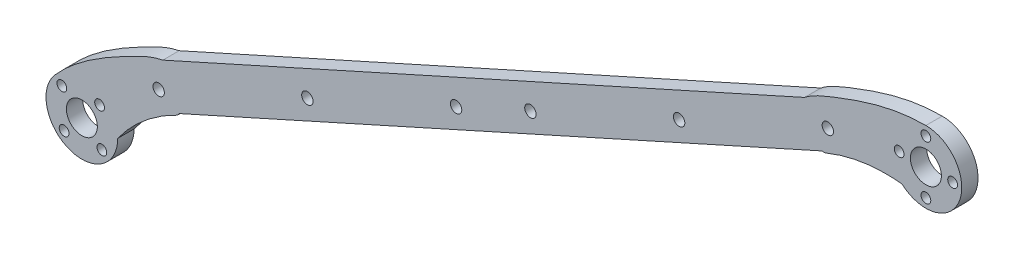
ISO-10303-21;
HEADER;
FILE_DESCRIPTION(('STEP AP214'),'2;1');
FILE_NAME('part.step','',(''),(''),'','','');
FILE_SCHEMA(('AUTOMOTIVE_DESIGN { 1 0 10303 214 1 1 1 1 }'));
ENDSEC;
DATA;
#1=APPLICATION_CONTEXT('core data for automotive mechanical design processes');
#2=APPLICATION_PROTOCOL_DEFINITION('international standard','automotive_design',2000,#1);
#3=PRODUCT_CONTEXT('',#1,'mechanical');
#4=PRODUCT('Part','Part','',(#3));
#5=PRODUCT_RELATED_PRODUCT_CATEGORY('part','',(#4));
#6=PRODUCT_DEFINITION_FORMATION('','',#4);
#7=PRODUCT_DEFINITION_CONTEXT('part definition',#1,'design');
#8=PRODUCT_DEFINITION('design','',#6,#7);
#9=PRODUCT_DEFINITION_SHAPE('','',#8);
#10=(LENGTH_UNIT() NAMED_UNIT(*) SI_UNIT(.MILLI.,.METRE.));
#11=(NAMED_UNIT(*) PLANE_ANGLE_UNIT() SI_UNIT($,.RADIAN.));
#12=(NAMED_UNIT(*) SI_UNIT($,.STERADIAN.) SOLID_ANGLE_UNIT());
#13=UNCERTAINTY_MEASURE_WITH_UNIT(LENGTH_MEASURE(1.E-05),#10,'distance_accuracy_value','');
#14=(GEOMETRIC_REPRESENTATION_CONTEXT(3) GLOBAL_UNCERTAINTY_ASSIGNED_CONTEXT((#13)) GLOBAL_UNIT_ASSIGNED_CONTEXT((#10,
#11,#12)) REPRESENTATION_CONTEXT('',''));
#15=CARTESIAN_POINT('',(0.,0.,0.));
#16=DIRECTION('',(0.,0.,1.));
#17=DIRECTION('',(1.,0.,0.));
#18=AXIS2_PLACEMENT_3D('',#15,#16,#17);
#19=CARTESIAN_POINT('',(-19.0941770977098,-8.43318287138601,5.));
#20=DIRECTION('',(0.,0.,-1.));
#21=DIRECTION('',(-1.,0.,0.));
#22=AXIS2_PLACEMENT_3D('',#19,#20,#21);
#23=PLANE('',#22);
#24=CARTESIAN_POINT('',(-30.5499471959969,-11.5955622866371,5.));
#25=CARTESIAN_POINT('',(-23.0287483220892,-8.51171838883883,5.));
#26=CARTESIAN_POINT('',(-15.2617011691616,-7.37824850597816,5.));
#27=CARTESIAN_POINT('',(-7.33212111192934,-8.2,5.));
#28=B_SPLINE_CURVE_WITH_KNOTS('',3,(#24,#25,#26,#27),.UNSPECIFIED.,.F.,.F.,(4,4),(0.,
0.928485629099403),.UNSPECIFIED.);
#29=CARTESIAN_POINT('',(-30.5499471959969,-11.595562286637,5.));
#30=VERTEX_POINT('',#29);
#31=CARTESIAN_POINT('',(-7.33212111192934,-8.2,5.));
#32=VERTEX_POINT('',#31);
#33=EDGE_CURVE('E186',#30,#32,#28,.T.);
#34=ORIENTED_EDGE('',*,*,#33,.T.);
#35=CARTESIAN_POINT('',(0.,0.,5.));
#36=DIRECTION('',(0.,0.,1.));
#37=DIRECTION('',(1.,0.,0.));
#38=AXIS2_PLACEMENT_3D('',#35,#36,#37);
#39=CIRCLE('',#38,11.);
#40=CARTESIAN_POINT('',(0.,11.,5.));
#41=VERTEX_POINT('',#40);
#42=EDGE_CURVE('E104',#32,#41,#39,.T.);
#43=ORIENTED_EDGE('',*,*,#42,.T.);
#44=CARTESIAN_POINT('',(0.,11.,5.));
#45=CARTESIAN_POINT('',(-10.1101240344233,10.9882488076497,5.));
#46=CARTESIAN_POINT('',(-22.331904830044,6.92754020950869,5.));
#47=CARTESIAN_POINT('',(-34.7332411971314,1.80300777675755,5.));
#48=CARTESIAN_POINT('',(-37.2233274582157,-0.160922186825868,5.));
#49=B_SPLINE_CURVE_WITH_KNOTS('',3,(#44,#45,#46,#47,#48),.UNSPECIFIED.,.F.,.F.,(4,1,4),
(0.0398764755532066,0.76340919900868,1.),.UNSPECIFIED.);
#50=CARTESIAN_POINT('',(-37.2233274582157,-0.160922186825868,5.));
#51=VERTEX_POINT('',#50);
#52=EDGE_CURVE('E207',#41,#51,#49,.T.);
#53=ORIENTED_EDGE('',*,*,#52,.T.);
#54=DIRECTION('',(-0.912045728476409,-0.410088513821023,0.));
#55=VECTOR('',#54,1.);
#56=CARTESIAN_POINT('',(-37.2233274582158,-0.160922186825877,5.));
#57=LINE('',#56,#55);
#58=CARTESIAN_POINT('',(-234.014760878466,-88.645418023272,5.));
#59=VERTEX_POINT('',#58);
#60=EDGE_CURVE('E226',#51,#59,#57,.T.);
#61=ORIENTED_EDGE('',*,*,#60,.T.);
#62=CARTESIAN_POINT('',(-234.014760878466,-88.645418023272,5.));
#63=CARTESIAN_POINT('',(-237.13641474897,-89.2047279572726,5.));
#64=CARTESIAN_POINT('',(-249.199971308159,-95.0804899918692,5.));
#65=CARTESIAN_POINT('',(-260.348583277408,-101.527949281724,5.));
#66=CARTESIAN_POINT('',(-267.067006190117,-109.082917160407,5.));
#67=B_SPLINE_CURVE_WITH_KNOTS('',3,(#62,#63,#64,#65,#66),.UNSPECIFIED.,.F.,.F.,(4,1,4),
(0.0398764755532066,0.276467276544526,1.),.UNSPECIFIED.);
#68=CARTESIAN_POINT('',(-267.067006190117,-109.082917160407,5.));
#69=VERTEX_POINT('',#68);
#70=EDGE_CURVE('E223',#59,#69,#67,.T.);
#71=ORIENTED_EDGE('',*,*,#70,.T.);
#72=CARTESIAN_POINT('',(-258.838577688908,-116.383120198712,5.));
#73=DIRECTION('',(0.,0.,1.));
#74=DIRECTION('',(-1.,0.,0.));
#75=AXIS2_PLACEMENT_3D('',#72,#73,#74);
#76=CIRCLE('',#75,11.);
#77=CARTESIAN_POINT('',(-247.838660731776,-116.340377524383,5.));
#78=VERTEX_POINT('',#77);
#79=EDGE_CURVE('E225',#69,#78,#76,.T.);
#80=ORIENTED_EDGE('',*,*,#79,.T.);
#81=CARTESIAN_POINT('',(-247.838660731776,-116.340377524383,5.));
#82=CARTESIAN_POINT('',(-243.190858821597,-109.863383406298,5.));
#83=CARTESIAN_POINT('',(-237.188340902156,-104.805562326234,5.));
#84=CARTESIAN_POINT('',(-229.890025639162,-101.226020454874,5.));
#85=B_SPLINE_CURVE_WITH_KNOTS('',3,(#81,#82,#83,#84),.UNSPECIFIED.,.F.,.F.,(4,4),(0.,
0.928485629099403),.UNSPECIFIED.);
#86=CARTESIAN_POINT('',(-229.890025639162,-101.226020454874,5.));
#87=VERTEX_POINT('',#86);
#88=EDGE_CURVE('E129',#78,#87,#85,.T.);
#89=ORIENTED_EDGE('',*,*,#88,.T.);
#90=CARTESIAN_POINT('',(-230.770724166718,-99.4303673415022,5.));
#91=DIRECTION('',(0.,0.,1.));
#92=DIRECTION('',(1.,0.,0.));
#93=AXIS2_PLACEMENT_3D('',#90,#91,#92);
#94=CIRCLE('',#93,1.99999999999988);
#95=CARTESIAN_POINT('',(-228.983312246708,-100.327673659437,5.));
#96=VERTEX_POINT('',#95);
#97=EDGE_CURVE('E123',#87,#96,#94,.T.);
#98=ORIENTED_EDGE('',*,*,#97,.T.);
#99=DIRECTION('',(0.91204572847641,0.410088513821023,0.));
#100=VECTOR('',#99,1.);
#101=CARTESIAN_POINT('',(-228.983312246708,-100.327673659437,5.));
#102=LINE('',#101,#100);
#103=CARTESIAN_POINT('',(-31.8236903085434,-11.6776270425826,5.));
#104=VERTEX_POINT('',#103);
#105=EDGE_CURVE('E127',#96,#104,#102,.T.);
#106=ORIENTED_EDGE('',*,*,#105,.T.);
#107=CARTESIAN_POINT('',(-31.3086858496027,-9.74507163399268,5.));
#108=DIRECTION('',(0.,0.,1.));
#109=DIRECTION('',(-1.,0.,0.));
#110=AXIS2_PLACEMENT_3D('',#107,#108,#109);
#111=CIRCLE('',#110,1.99999999999989);
#112=EDGE_CURVE('E55',#104,#30,#111,.T.);
#113=ORIENTED_EDGE('',*,*,#112,.T.);
#114=EDGE_LOOP('',(#34,#43,#53,#61,#71,#80,#89,#98,#106,#113));
#115=FACE_BOUND('',#114,.T.);
#116=CARTESIAN_POINT('',(-8.2,0.,5.));
#117=DIRECTION('',(0.,0.,1.));
#118=DIRECTION('',(1.,0.,0.));
#119=AXIS2_PLACEMENT_3D('',#116,#117,#118);
#120=CIRCLE('',#119,1.5);
#121=CARTESIAN_POINT('',(-6.7,0.,5.));
#122=VERTEX_POINT('',#121);
#123=EDGE_CURVE('E153',#122,#122,#120,.T.);
#124=ORIENTED_EDGE('',*,*,#123,.F.);
#125=EDGE_LOOP('',(#124));
#126=FACE_BOUND('',#125,.T.);
#127=CARTESIAN_POINT('',(0.,8.2,5.));
#128=DIRECTION('',(0.,0.,1.));
#129=DIRECTION('',(1.,0.,0.));
#130=AXIS2_PLACEMENT_3D('',#127,#128,#129);
#131=CIRCLE('',#130,1.5);
#132=CARTESIAN_POINT('',(1.5,8.2,5.));
#133=VERTEX_POINT('',#132);
#134=EDGE_CURVE('E264',#133,#133,#131,.T.);
#135=ORIENTED_EDGE('',*,*,#134,.F.);
#136=EDGE_LOOP('',(#135));
#137=FACE_BOUND('',#136,.T.);
#138=CARTESIAN_POINT('',(0.,-8.2,5.));
#139=DIRECTION('',(0.,0.,1.));
#140=DIRECTION('',(1.,0.,0.));
#141=AXIS2_PLACEMENT_3D('',#138,#139,#140);
#142=CIRCLE('',#141,1.5);
#143=CARTESIAN_POINT('',(1.5,-8.2,5.));
#144=VERTEX_POINT('',#143);
#145=EDGE_CURVE('E270',#144,#144,#142,.T.);
#146=ORIENTED_EDGE('',*,*,#145,.F.);
#147=EDGE_LOOP('',(#146));
#148=FACE_BOUND('',#147,.T.);
#149=CARTESIAN_POINT('',(8.2,0.,5.));
#150=DIRECTION('',(0.,0.,1.));
#151=DIRECTION('',(1.,0.,0.));
#152=AXIS2_PLACEMENT_3D('',#149,#150,#151);
#153=CIRCLE('',#152,1.5);
#154=CARTESIAN_POINT('',(9.7,0.,5.));
#155=VERTEX_POINT('',#154);
#156=EDGE_CURVE('E276',#155,#155,#153,.T.);
#157=ORIENTED_EDGE('',*,*,#156,.F.);
#158=EDGE_LOOP('',(#157));
#159=FACE_BOUND('',#158,.T.);
#160=CARTESIAN_POINT('',(0.,0.,5.));
#161=DIRECTION('',(0.,0.,1.));
#162=DIRECTION('',(1.,0.,0.));
#163=AXIS2_PLACEMENT_3D('',#160,#161,#162);
#164=CIRCLE('',#163,4.75);
#165=CARTESIAN_POINT('',(4.75,0.,5.));
#166=VERTEX_POINT('',#165);
#167=EDGE_CURVE('E282',#166,#166,#164,.T.);
#168=ORIENTED_EDGE('',*,*,#167,.F.);
#169=EDGE_LOOP('',(#168));
#170=FACE_BOUND('',#169,.T.);
#171=CARTESIAN_POINT('',(-30.0717688274586,-4.81157505708729,5.));
#172=DIRECTION('',(0.,0.,1.));
#173=DIRECTION('',(1.,0.,0.));
#174=AXIS2_PLACEMENT_3D('',#171,#172,#173);
#175=CIRCLE('',#174,1.75);
#176=CARTESIAN_POINT('',(-28.3217688274586,-4.81157505708729,5.));
#177=VERTEX_POINT('',#176);
#178=EDGE_CURVE('E288',#177,#177,#175,.T.);
#179=ORIENTED_EDGE('',*,*,#178,.F.);
#180=EDGE_LOOP('',(#179));
#181=FACE_BOUND('',#180,.T.);
#182=CARTESIAN_POINT('',(-75.674055251279,-25.3160007481384,5.));
#183=DIRECTION('',(0.,0.,1.));
#184=DIRECTION('',(1.,0.,0.));
#185=AXIS2_PLACEMENT_3D('',#182,#183,#184);
#186=CIRCLE('',#185,1.75);
#187=CARTESIAN_POINT('',(-73.924055251279,-25.3160007481384,5.));
#188=VERTEX_POINT('',#187);
#189=EDGE_CURVE('E294',#188,#188,#186,.T.);
#190=ORIENTED_EDGE('',*,*,#189,.F.);
#191=EDGE_LOOP('',(#190));
#192=FACE_BOUND('',#191,.T.);
#193=CARTESIAN_POINT('',(-121.276341675099,-45.8204264391896,5.));
#194=DIRECTION('',(0.,0.,1.));
#195=DIRECTION('',(1.,0.,0.));
#196=AXIS2_PLACEMENT_3D('',#193,#194,#195);
#197=CIRCLE('',#196,1.75);
#198=CARTESIAN_POINT('',(-119.526341675099,-45.8204264391896,5.));
#199=VERTEX_POINT('',#198);
#200=EDGE_CURVE('E300',#199,#199,#197,.T.);
#201=ORIENTED_EDGE('',*,*,#200,.F.);
#202=EDGE_LOOP('',(#201));
#203=FACE_BOUND('',#202,.T.);
#204=CARTESIAN_POINT('',(-235.282057734646,-97.0814906668156,5.));
#205=DIRECTION('',(0.,0.,1.));
#206=DIRECTION('',(-1.,0.,0.));
#207=AXIS2_PLACEMENT_3D('',#204,#205,#206);
#208=CIRCLE('',#207,1.75000000000002);
#209=CARTESIAN_POINT('',(-237.032057734646,-97.0814906668156,5.));
#210=VERTEX_POINT('',#209);
#211=EDGE_CURVE('E306',#210,#210,#208,.T.);
#212=ORIENTED_EDGE('',*,*,#211,.F.);
#213=EDGE_LOOP('',(#212));
#214=FACE_BOUND('',#213,.T.);
#215=CARTESIAN_POINT('',(-189.679771310826,-76.5770649757645,5.));
#216=DIRECTION('',(0.,0.,1.));
#217=DIRECTION('',(-1.,0.,0.));
#218=AXIS2_PLACEMENT_3D('',#215,#216,#217);
#219=CIRCLE('',#218,1.75000000000002);
#220=CARTESIAN_POINT('',(-191.429771310826,-76.5770649757645,5.));
#221=VERTEX_POINT('',#220);
#222=EDGE_CURVE('E312',#221,#221,#219,.T.);
#223=ORIENTED_EDGE('',*,*,#222,.F.);
#224=EDGE_LOOP('',(#223));
#225=FACE_BOUND('',#224,.T.);
#226=CARTESIAN_POINT('',(-258.838577688908,-116.383120198712,5.));
#227=DIRECTION('',(0.,0.,1.));
#228=DIRECTION('',(-1.,0.,0.));
#229=AXIS2_PLACEMENT_3D('',#226,#227,#228);
#230=CIRCLE('',#229,4.75);
#231=CARTESIAN_POINT('',(-263.588577688908,-116.383120198712,5.));
#232=VERTEX_POINT('',#231);
#233=EDGE_CURVE('E318',#232,#232,#230,.T.);
#234=ORIENTED_EDGE('',*,*,#233,.F.);
#235=EDGE_LOOP('',(#234));
#236=FACE_BOUND('',#235,.T.);
#237=CARTESIAN_POINT('',(-264.280547226554,-122.517039626886,5.));
#238=DIRECTION('',(0.,0.,1.));
#239=DIRECTION('',(-1.,0.,0.));
#240=AXIS2_PLACEMENT_3D('',#237,#238,#239);
#241=CIRCLE('',#240,1.49999999999994);
#242=CARTESIAN_POINT('',(-265.780547226554,-122.517039626886,5.));
#243=VERTEX_POINT('',#242);
#244=EDGE_CURVE('E324',#243,#243,#241,.T.);
#245=ORIENTED_EDGE('',*,*,#244,.F.);
#246=EDGE_LOOP('',(#245));
#247=FACE_BOUND('',#246,.T.);
#248=CARTESIAN_POINT('',(-252.704658260734,-121.825089736358,5.));
#249=DIRECTION('',(0.,0.,1.));
#250=DIRECTION('',(-1.,0.,0.));
#251=AXIS2_PLACEMENT_3D('',#248,#249,#250);
#252=CIRCLE('',#251,1.49999999999994);
#253=CARTESIAN_POINT('',(-254.204658260734,-121.825089736358,5.));
#254=VERTEX_POINT('',#253);
#255=EDGE_CURVE('E330',#254,#254,#252,.T.);
#256=ORIENTED_EDGE('',*,*,#255,.F.);
#257=EDGE_LOOP('',(#256));
#258=FACE_BOUND('',#257,.T.);
#259=CARTESIAN_POINT('',(-264.972497117082,-110.941150661066,5.));
#260=DIRECTION('',(0.,0.,1.));
#261=DIRECTION('',(-1.,0.,0.));
#262=AXIS2_PLACEMENT_3D('',#259,#260,#261);
#263=CIRCLE('',#262,1.49999999999998);
#264=CARTESIAN_POINT('',(-266.472497117082,-110.941150661066,5.));
#265=VERTEX_POINT('',#264);
#266=EDGE_CURVE('E336',#265,#265,#263,.T.);
#267=ORIENTED_EDGE('',*,*,#266,.F.);
#268=EDGE_LOOP('',(#267));
#269=FACE_BOUND('',#268,.T.);
#270=CARTESIAN_POINT('',(-144.077484887006,-56.0726392847133,5.));
#271=DIRECTION('',(0.,0.,1.));
#272=DIRECTION('',(-1.,0.,0.));
#273=AXIS2_PLACEMENT_3D('',#270,#271,#272);
#274=CIRCLE('',#273,1.74999999999999);
#275=CARTESIAN_POINT('',(-145.827484887006,-56.0726392847133,5.));
#276=VERTEX_POINT('',#275);
#277=EDGE_CURVE('E342',#276,#276,#274,.T.);
#278=ORIENTED_EDGE('',*,*,#277,.F.);
#279=EDGE_LOOP('',(#278));
#280=FACE_BOUND('',#279,.T.);
#281=CARTESIAN_POINT('',(-253.396608151262,-110.249200770538,5.));
#282=DIRECTION('',(0.,0.,1.));
#283=DIRECTION('',(-1.,0.,0.));
#284=AXIS2_PLACEMENT_3D('',#281,#282,#283);
#285=CIRCLE('',#284,1.50000000000004);
#286=CARTESIAN_POINT('',(-254.896608151262,-110.249200770538,5.));
#287=VERTEX_POINT('',#286);
#288=EDGE_CURVE('E348',#287,#287,#285,.T.);
#289=ORIENTED_EDGE('',*,*,#288,.F.);
#290=EDGE_LOOP('',(#289));
#291=FACE_BOUND('',#290,.T.);
#292=ADVANCED_FACE('F37',(#115,#126,#137,#148,#159,#170,#181,#192,#203,#214,#225,#236,#247,#258,
#269,#280,#291),#23,.F.);
#293=CARTESIAN_POINT('',(-19.0941770977098,-8.43318287138601,0.));
#294=DIRECTION('',(0.,0.,-1.));
#295=DIRECTION('',(-1.,0.,0.));
#296=AXIS2_PLACEMENT_3D('',#293,#294,#295);
#297=PLANE('',#296);
#298=CARTESIAN_POINT('',(-144.077484887006,-56.0726392847133,0.));
#299=DIRECTION('',(0.,0.,1.));
#300=DIRECTION('',(-1.,0.,0.));
#301=AXIS2_PLACEMENT_3D('',#298,#299,#300);
#302=CIRCLE('',#301,1.74999999999999);
#303=CARTESIAN_POINT('',(-145.827484887006,-56.0726392847133,0.));
#304=VERTEX_POINT('',#303);
#305=EDGE_CURVE('E345',#304,#304,#302,.T.);
#306=ORIENTED_EDGE('',*,*,#305,.T.);
#307=EDGE_LOOP('',(#306));
#308=FACE_BOUND('',#307,.T.);
#309=CARTESIAN_POINT('',(-252.704658260734,-121.825089736358,0.));
#310=DIRECTION('',(0.,0.,1.));
#311=DIRECTION('',(-1.,0.,0.));
#312=AXIS2_PLACEMENT_3D('',#309,#310,#311);
#313=CIRCLE('',#312,1.49999999999994);
#314=CARTESIAN_POINT('',(-254.204658260734,-121.825089736358,0.));
#315=VERTEX_POINT('',#314);
#316=EDGE_CURVE('E333',#315,#315,#313,.T.);
#317=ORIENTED_EDGE('',*,*,#316,.T.);
#318=EDGE_LOOP('',(#317));
#319=FACE_BOUND('',#318,.T.);
#320=CARTESIAN_POINT('',(-258.838577688908,-116.383120198712,0.));
#321=DIRECTION('',(0.,0.,1.));
#322=DIRECTION('',(-1.,0.,0.));
#323=AXIS2_PLACEMENT_3D('',#320,#321,#322);
#324=CIRCLE('',#323,4.75);
#325=CARTESIAN_POINT('',(-263.588577688908,-116.383120198712,0.));
#326=VERTEX_POINT('',#325);
#327=EDGE_CURVE('E321',#326,#326,#324,.T.);
#328=ORIENTED_EDGE('',*,*,#327,.T.);
#329=EDGE_LOOP('',(#328));
#330=FACE_BOUND('',#329,.T.);
#331=CARTESIAN_POINT('',(-235.282057734646,-97.0814906668156,0.));
#332=DIRECTION('',(0.,0.,1.));
#333=DIRECTION('',(-1.,0.,0.));
#334=AXIS2_PLACEMENT_3D('',#331,#332,#333);
#335=CIRCLE('',#334,1.75000000000002);
#336=CARTESIAN_POINT('',(-237.032057734646,-97.0814906668156,0.));
#337=VERTEX_POINT('',#336);
#338=EDGE_CURVE('E309',#337,#337,#335,.T.);
#339=ORIENTED_EDGE('',*,*,#338,.T.);
#340=EDGE_LOOP('',(#339));
#341=FACE_BOUND('',#340,.T.);
#342=CARTESIAN_POINT('',(-75.674055251279,-25.3160007481384,0.));
#343=DIRECTION('',(0.,0.,1.));
#344=DIRECTION('',(1.,0.,0.));
#345=AXIS2_PLACEMENT_3D('',#342,#343,#344);
#346=CIRCLE('',#345,1.75);
#347=CARTESIAN_POINT('',(-73.924055251279,-25.3160007481384,0.));
#348=VERTEX_POINT('',#347);
#349=EDGE_CURVE('E297',#348,#348,#346,.T.);
#350=ORIENTED_EDGE('',*,*,#349,.T.);
#351=EDGE_LOOP('',(#350));
#352=FACE_BOUND('',#351,.T.);
#353=CARTESIAN_POINT('',(0.,0.,0.));
#354=DIRECTION('',(0.,0.,1.));
#355=DIRECTION('',(1.,0.,0.));
#356=AXIS2_PLACEMENT_3D('',#353,#354,#355);
#357=CIRCLE('',#356,4.75);
#358=CARTESIAN_POINT('',(4.75,0.,0.));
#359=VERTEX_POINT('',#358);
#360=EDGE_CURVE('E285',#359,#359,#357,.T.);
#361=ORIENTED_EDGE('',*,*,#360,.T.);
#362=EDGE_LOOP('',(#361));
#363=FACE_BOUND('',#362,.T.);
#364=CARTESIAN_POINT('',(0.,-8.2,0.));
#365=DIRECTION('',(0.,0.,1.));
#366=DIRECTION('',(1.,0.,0.));
#367=AXIS2_PLACEMENT_3D('',#364,#365,#366);
#368=CIRCLE('',#367,1.5);
#369=CARTESIAN_POINT('',(1.5,-8.2,0.));
#370=VERTEX_POINT('',#369);
#371=EDGE_CURVE('E273',#370,#370,#368,.T.);
#372=ORIENTED_EDGE('',*,*,#371,.T.);
#373=EDGE_LOOP('',(#372));
#374=FACE_BOUND('',#373,.T.);
#375=CARTESIAN_POINT('',(-8.2,0.,0.));
#376=DIRECTION('',(0.,0.,1.));
#377=DIRECTION('',(1.,0.,0.));
#378=AXIS2_PLACEMENT_3D('',#375,#376,#377);
#379=CIRCLE('',#378,1.5);
#380=CARTESIAN_POINT('',(-6.7,0.,0.));
#381=VERTEX_POINT('',#380);
#382=EDGE_CURVE('E258',#381,#381,#379,.T.);
#383=ORIENTED_EDGE('',*,*,#382,.T.);
#384=EDGE_LOOP('',(#383));
#385=FACE_BOUND('',#384,.T.);
#386=CARTESIAN_POINT('',(-30.5499471959969,-11.5955622866371,0.));
#387=CARTESIAN_POINT('',(-23.0287483220892,-8.51171838883883,0.));
#388=CARTESIAN_POINT('',(-15.2617011691616,-7.37824850597816,0.));
#389=CARTESIAN_POINT('',(-7.33212111192934,-8.2,0.));
#390=B_SPLINE_CURVE_WITH_KNOTS('',3,(#386,#387,#388,#389),.UNSPECIFIED.,.F.,.F.,(4,4),(0.,
0.928485629099403),.UNSPECIFIED.);
#391=CARTESIAN_POINT('',(-30.5499471959969,-11.595562286637,0.));
#392=VERTEX_POINT('',#391);
#393=CARTESIAN_POINT('',(-7.33212111192934,-8.2,0.));
#394=VERTEX_POINT('',#393);
#395=EDGE_CURVE('E147',#392,#394,#390,.T.);
#396=ORIENTED_EDGE('',*,*,#395,.F.);
#397=CARTESIAN_POINT('',(-31.3086858496027,-9.74507163399268,0.));
#398=DIRECTION('',(0.,0.,1.));
#399=DIRECTION('',(-1.,0.,0.));
#400=AXIS2_PLACEMENT_3D('',#397,#398,#399);
#401=CIRCLE('',#400,1.99999999999989);
#402=CARTESIAN_POINT('',(-31.8236903085434,-11.6776270425826,0.));
#403=VERTEX_POINT('',#402);
#404=EDGE_CURVE('E96',#403,#392,#401,.T.);
#405=ORIENTED_EDGE('',*,*,#404,.F.);
#406=DIRECTION('',(0.91204572847641,0.410088513821023,0.));
#407=VECTOR('',#406,1.);
#408=CARTESIAN_POINT('',(-228.983312246708,-100.327673659437,0.));
#409=LINE('',#408,#407);
#410=CARTESIAN_POINT('',(-228.983312246708,-100.327673659437,0.));
#411=VERTEX_POINT('',#410);
#412=EDGE_CURVE('E90',#411,#403,#409,.T.);
#413=ORIENTED_EDGE('',*,*,#412,.F.);
#414=CARTESIAN_POINT('',(-230.770724166718,-99.4303673415022,0.));
#415=DIRECTION('',(0.,0.,1.));
#416=DIRECTION('',(1.,0.,0.));
#417=AXIS2_PLACEMENT_3D('',#414,#415,#416);
#418=CIRCLE('',#417,1.99999999999988);
#419=CARTESIAN_POINT('',(-229.890025639162,-101.226020454874,0.));
#420=VERTEX_POINT('',#419);
#421=EDGE_CURVE('E137',#420,#411,#418,.T.);
#422=ORIENTED_EDGE('',*,*,#421,.F.);
#423=CARTESIAN_POINT('',(-247.838660731776,-116.340377524383,0.));
#424=CARTESIAN_POINT('',(-243.190858821597,-109.863383406298,0.));
#425=CARTESIAN_POINT('',(-237.188340902156,-104.805562326234,0.));
#426=CARTESIAN_POINT('',(-229.890025639162,-101.226020454874,0.));
#427=B_SPLINE_CURVE_WITH_KNOTS('',3,(#423,#424,#425,#426),.UNSPECIFIED.,.F.,.F.,(4,4),(0.,
0.928485629099403),.UNSPECIFIED.);
#428=CARTESIAN_POINT('',(-247.838660731776,-116.340377524383,0.));
#429=VERTEX_POINT('',#428);
#430=EDGE_CURVE('E176',#429,#420,#427,.T.);
#431=ORIENTED_EDGE('',*,*,#430,.F.);
#432=CARTESIAN_POINT('',(-258.838577688908,-116.383120198712,0.));
#433=DIRECTION('',(0.,0.,1.));
#434=DIRECTION('',(-1.,0.,0.));
#435=AXIS2_PLACEMENT_3D('',#432,#433,#434);
#436=CIRCLE('',#435,11.);
#437=CARTESIAN_POINT('',(-267.067006190117,-109.082917160407,0.));
#438=VERTEX_POINT('',#437);
#439=EDGE_CURVE('E171',#438,#429,#436,.T.);
#440=ORIENTED_EDGE('',*,*,#439,.F.);
#441=CARTESIAN_POINT('',(-234.014760878466,-88.645418023272,0.));
#442=CARTESIAN_POINT('',(-237.13641474897,-89.2047279572726,0.));
#443=CARTESIAN_POINT('',(-249.199971308159,-95.0804899918692,0.));
#444=CARTESIAN_POINT('',(-260.348583277408,-101.527949281724,0.));
#445=CARTESIAN_POINT('',(-267.067006190117,-109.082917160407,0.));
#446=B_SPLINE_CURVE_WITH_KNOTS('',3,(#441,#442,#443,#444,#445),.UNSPECIFIED.,.F.,.F.,(4,1,4),
(0.0398764755532066,0.276467276544526,1.),.UNSPECIFIED.);
#447=CARTESIAN_POINT('',(-234.014760878466,-88.645418023272,0.));
#448=VERTEX_POINT('',#447);
#449=EDGE_CURVE('E167',#448,#438,#446,.T.);
#450=ORIENTED_EDGE('',*,*,#449,.F.);
#451=DIRECTION('',(-0.912045728476409,-0.410088513821023,0.));
#452=VECTOR('',#451,1.);
#453=CARTESIAN_POINT('',(-37.2233274582158,-0.160922186825877,0.));
#454=LINE('',#453,#452);
#455=CARTESIAN_POINT('',(-37.2233274582157,-0.160922186825868,0.));
#456=VERTEX_POINT('',#455);
#457=EDGE_CURVE('E162',#456,#448,#454,.T.);
#458=ORIENTED_EDGE('',*,*,#457,.F.);
#459=CARTESIAN_POINT('',(0.,11.,0.));
#460=CARTESIAN_POINT('',(-10.1101240344233,10.9882488076497,0.));
#461=CARTESIAN_POINT('',(-22.331904830044,6.92754020950869,0.));
#462=CARTESIAN_POINT('',(-34.7332411971314,1.80300777675755,0.));
#463=CARTESIAN_POINT('',(-37.2233274582157,-0.160922186825868,0.));
#464=B_SPLINE_CURVE_WITH_KNOTS('',3,(#459,#460,#461,#462,#463),.UNSPECIFIED.,.F.,.F.,(4,1,4),
(0.0398764755532066,0.76340919900868,1.),.UNSPECIFIED.);
#465=CARTESIAN_POINT('',(0.,11.,0.));
#466=VERTEX_POINT('',#465);
#467=EDGE_CURVE('E158',#466,#456,#464,.T.);
#468=ORIENTED_EDGE('',*,*,#467,.F.);
#469=CARTESIAN_POINT('',(0.,0.,0.));
#470=DIRECTION('',(0.,0.,1.));
#471=DIRECTION('',(1.,0.,0.));
#472=AXIS2_PLACEMENT_3D('',#469,#470,#471);
#473=CIRCLE('',#472,11.);
#474=EDGE_CURVE('E152',#394,#466,#473,.T.);
#475=ORIENTED_EDGE('',*,*,#474,.F.);
#476=EDGE_LOOP('',(#396,#405,#413,#422,#431,#440,#450,#458,#468,#475));
#477=FACE_BOUND('',#476,.T.);
#478=CARTESIAN_POINT('',(0.,8.2,0.));
#479=DIRECTION('',(0.,0.,1.));
#480=DIRECTION('',(1.,0.,0.));
#481=AXIS2_PLACEMENT_3D('',#478,#479,#480);
#482=CIRCLE('',#481,1.5);
#483=CARTESIAN_POINT('',(1.5,8.2,0.));
#484=VERTEX_POINT('',#483);
#485=EDGE_CURVE('E267',#484,#484,#482,.T.);
#486=ORIENTED_EDGE('',*,*,#485,.T.);
#487=EDGE_LOOP('',(#486));
#488=FACE_BOUND('',#487,.T.);
#489=CARTESIAN_POINT('',(8.2,0.,0.));
#490=DIRECTION('',(0.,0.,1.));
#491=DIRECTION('',(1.,0.,0.));
#492=AXIS2_PLACEMENT_3D('',#489,#490,#491);
#493=CIRCLE('',#492,1.5);
#494=CARTESIAN_POINT('',(9.7,0.,0.));
#495=VERTEX_POINT('',#494);
#496=EDGE_CURVE('E279',#495,#495,#493,.T.);
#497=ORIENTED_EDGE('',*,*,#496,.T.);
#498=EDGE_LOOP('',(#497));
#499=FACE_BOUND('',#498,.T.);
#500=CARTESIAN_POINT('',(-30.0717688274586,-4.81157505708729,0.));
#501=DIRECTION('',(0.,0.,1.));
#502=DIRECTION('',(1.,0.,0.));
#503=AXIS2_PLACEMENT_3D('',#500,#501,#502);
#504=CIRCLE('',#503,1.75);
#505=CARTESIAN_POINT('',(-28.3217688274586,-4.81157505708729,0.));
#506=VERTEX_POINT('',#505);
#507=EDGE_CURVE('E291',#506,#506,#504,.T.);
#508=ORIENTED_EDGE('',*,*,#507,.T.);
#509=EDGE_LOOP('',(#508));
#510=FACE_BOUND('',#509,.T.);
#511=CARTESIAN_POINT('',(-121.276341675099,-45.8204264391896,0.));
#512=DIRECTION('',(0.,0.,1.));
#513=DIRECTION('',(1.,0.,0.));
#514=AXIS2_PLACEMENT_3D('',#511,#512,#513);
#515=CIRCLE('',#514,1.75);
#516=CARTESIAN_POINT('',(-119.526341675099,-45.8204264391896,0.));
#517=VERTEX_POINT('',#516);
#518=EDGE_CURVE('E303',#517,#517,#515,.T.);
#519=ORIENTED_EDGE('',*,*,#518,.T.);
#520=EDGE_LOOP('',(#519));
#521=FACE_BOUND('',#520,.T.);
#522=CARTESIAN_POINT('',(-189.679771310826,-76.5770649757645,0.));
#523=DIRECTION('',(0.,0.,1.));
#524=DIRECTION('',(-1.,0.,0.));
#525=AXIS2_PLACEMENT_3D('',#522,#523,#524);
#526=CIRCLE('',#525,1.75000000000002);
#527=CARTESIAN_POINT('',(-191.429771310826,-76.5770649757645,0.));
#528=VERTEX_POINT('',#527);
#529=EDGE_CURVE('E315',#528,#528,#526,.T.);
#530=ORIENTED_EDGE('',*,*,#529,.T.);
#531=EDGE_LOOP('',(#530));
#532=FACE_BOUND('',#531,.T.);
#533=CARTESIAN_POINT('',(-264.280547226554,-122.517039626886,0.));
#534=DIRECTION('',(0.,0.,1.));
#535=DIRECTION('',(-1.,0.,0.));
#536=AXIS2_PLACEMENT_3D('',#533,#534,#535);
#537=CIRCLE('',#536,1.49999999999994);
#538=CARTESIAN_POINT('',(-265.780547226554,-122.517039626886,0.));
#539=VERTEX_POINT('',#538);
#540=EDGE_CURVE('E327',#539,#539,#537,.T.);
#541=ORIENTED_EDGE('',*,*,#540,.T.);
#542=EDGE_LOOP('',(#541));
#543=FACE_BOUND('',#542,.T.);
#544=CARTESIAN_POINT('',(-264.972497117082,-110.941150661066,0.));
#545=DIRECTION('',(0.,0.,1.));
#546=DIRECTION('',(-1.,0.,0.));
#547=AXIS2_PLACEMENT_3D('',#544,#545,#546);
#548=CIRCLE('',#547,1.49999999999998);
#549=CARTESIAN_POINT('',(-266.472497117082,-110.941150661066,0.));
#550=VERTEX_POINT('',#549);
#551=EDGE_CURVE('E339',#550,#550,#548,.T.);
#552=ORIENTED_EDGE('',*,*,#551,.T.);
#553=EDGE_LOOP('',(#552));
#554=FACE_BOUND('',#553,.T.);
#555=CARTESIAN_POINT('',(-253.396608151262,-110.249200770538,0.));
#556=DIRECTION('',(0.,0.,1.));
#557=DIRECTION('',(-1.,0.,0.));
#558=AXIS2_PLACEMENT_3D('',#555,#556,#557);
#559=CIRCLE('',#558,1.50000000000004);
#560=CARTESIAN_POINT('',(-254.896608151262,-110.249200770538,0.));
#561=VERTEX_POINT('',#560);
#562=EDGE_CURVE('E351',#561,#561,#559,.T.);
#563=ORIENTED_EDGE('',*,*,#562,.T.);
#564=EDGE_LOOP('',(#563));
#565=FACE_BOUND('',#564,.T.);
#566=ADVANCED_FACE('F211',(#308,#319,#330,#341,#352,#363,#374,#385,#477,#488,#499,#510,#521,
#532,#543,#554,#565),#297,.T.);
#567=DIRECTION('',(0.,0.,-1.));
#568=VECTOR('',#567,1.);
#569=SURFACE_OF_LINEAR_EXTRUSION('',#28,#568);
#570=ORIENTED_EDGE('',*,*,#395,.T.);
#571=DIRECTION('',(0.,0.,-1.));
#572=VECTOR('',#571,1.);
#573=CARTESIAN_POINT('',(-7.33212111192934,-8.2,5.));
#574=LINE('',#573,#572);
#575=EDGE_CURVE('E11',#32,#394,#574,.T.);
#576=ORIENTED_EDGE('',*,*,#575,.F.);
#577=ORIENTED_EDGE('',*,*,#33,.F.);
#578=DIRECTION('',(0.,0.,-1.));
#579=VECTOR('',#578,1.);
#580=CARTESIAN_POINT('',(-30.5499471959969,-11.595562286637,5.));
#581=LINE('',#580,#579);
#582=EDGE_CURVE('E143',#30,#392,#581,.T.);
#583=ORIENTED_EDGE('',*,*,#582,.T.);
#584=EDGE_LOOP('',(#570,#576,#577,#583));
#585=FACE_BOUND('',#584,.T.);
#586=ADVANCED_FACE('F39',(#585),#569,.F.);
#587=CARTESIAN_POINT('',(0.,0.,5.));
#588=DIRECTION('',(0.,0.,-1.));
#589=DIRECTION('',(-1.,0.,0.));
#590=AXIS2_PLACEMENT_3D('',#587,#588,#589);
#591=CYLINDRICAL_SURFACE('',#590,11.);
#592=ORIENTED_EDGE('',*,*,#474,.T.);
#593=DIRECTION('',(0.,0.,-1.));
#594=VECTOR('',#593,1.);
#595=CARTESIAN_POINT('',(0.,11.,5.));
#596=LINE('',#595,#594);
#597=EDGE_CURVE('E47',#41,#466,#596,.T.);
#598=ORIENTED_EDGE('',*,*,#597,.F.);
#599=ORIENTED_EDGE('',*,*,#42,.F.);
#600=ORIENTED_EDGE('',*,*,#575,.T.);
#601=EDGE_LOOP('',(#592,#598,#599,#600));
#602=FACE_BOUND('',#601,.T.);
#603=ADVANCED_FACE('F246',(#602),#591,.T.);
#604=DIRECTION('',(0.,0.,-1.));
#605=VECTOR('',#604,1.);
#606=SURFACE_OF_LINEAR_EXTRUSION('',#49,#605);
#607=ORIENTED_EDGE('',*,*,#467,.T.);
#608=DIRECTION('',(0.,0.,-1.));
#609=VECTOR('',#608,1.);
#610=CARTESIAN_POINT('',(-37.2233274582157,-0.160922186825868,5.));
#611=LINE('',#610,#609);
#612=EDGE_CURVE('E199',#51,#456,#611,.T.);
#613=ORIENTED_EDGE('',*,*,#612,.F.);
#614=ORIENTED_EDGE('',*,*,#52,.F.);
#615=ORIENTED_EDGE('',*,*,#597,.T.);
#616=EDGE_LOOP('',(#607,#613,#614,#615));
#617=FACE_BOUND('',#616,.T.);
#618=ADVANCED_FACE('F205',(#617),#606,.F.);
#619=CARTESIAN_POINT('',(-37.2233274582158,-0.160922186825877,5.));
#620=DIRECTION('',(0.410088513821023,-0.912045728476409,0.));
#621=DIRECTION('',(0.912045728476409,0.410088513821023,0.));
#622=AXIS2_PLACEMENT_3D('',#619,#620,#621);
#623=PLANE('',#622);
#624=ORIENTED_EDGE('',*,*,#457,.T.);
#625=DIRECTION('',(0.,0.,-1.));
#626=VECTOR('',#625,1.);
#627=CARTESIAN_POINT('',(-234.014760878466,-88.645418023272,5.));
#628=LINE('',#627,#626);
#629=EDGE_CURVE('E196',#59,#448,#628,.T.);
#630=ORIENTED_EDGE('',*,*,#629,.F.);
#631=ORIENTED_EDGE('',*,*,#60,.F.);
#632=ORIENTED_EDGE('',*,*,#612,.T.);
#633=EDGE_LOOP('',(#624,#630,#631,#632));
#634=FACE_BOUND('',#633,.T.);
#635=ADVANCED_FACE('F217',(#634),#623,.F.);
#636=DIRECTION('',(0.,0.,-1.));
#637=VECTOR('',#636,1.);
#638=SURFACE_OF_LINEAR_EXTRUSION('',#67,#637);
#639=ORIENTED_EDGE('',*,*,#449,.T.);
#640=DIRECTION('',(0.,0.,-1.));
#641=VECTOR('',#640,1.);
#642=CARTESIAN_POINT('',(-267.067006190117,-109.082917160407,5.));
#643=LINE('',#642,#641);
#644=EDGE_CURVE('E193',#69,#438,#643,.T.);
#645=ORIENTED_EDGE('',*,*,#644,.F.);
#646=ORIENTED_EDGE('',*,*,#70,.F.);
#647=ORIENTED_EDGE('',*,*,#629,.T.);
#648=EDGE_LOOP('',(#639,#645,#646,#647));
#649=FACE_BOUND('',#648,.T.);
#650=ADVANCED_FACE('F221',(#649),#638,.F.);
#651=CARTESIAN_POINT('',(-258.838577688908,-116.383120198712,5.));
#652=DIRECTION('',(0.,0.,-1.));
#653=DIRECTION('',(-1.,0.,0.));
#654=AXIS2_PLACEMENT_3D('',#651,#652,#653);
#655=CYLINDRICAL_SURFACE('',#654,11.);
#656=ORIENTED_EDGE('',*,*,#439,.T.);
#657=DIRECTION('',(0.,0.,-1.));
#658=VECTOR('',#657,1.);
#659=CARTESIAN_POINT('',(-247.838660731776,-116.340377524383,5.));
#660=LINE('',#659,#658);
#661=EDGE_CURVE('E190',#78,#429,#660,.T.);
#662=ORIENTED_EDGE('',*,*,#661,.F.);
#663=ORIENTED_EDGE('',*,*,#79,.F.);
#664=ORIENTED_EDGE('',*,*,#644,.T.);
#665=EDGE_LOOP('',(#656,#662,#663,#664));
#666=FACE_BOUND('',#665,.T.);
#667=ADVANCED_FACE('F241',(#666),#655,.T.);
#668=DIRECTION('',(0.,0.,-1.));
#669=VECTOR('',#668,1.);
#670=SURFACE_OF_LINEAR_EXTRUSION('',#85,#669);
#671=ORIENTED_EDGE('',*,*,#430,.T.);
#672=DIRECTION('',(0.,0.,-1.));
#673=VECTOR('',#672,1.);
#674=CARTESIAN_POINT('',(-229.890025639162,-101.226020454874,5.));
#675=LINE('',#674,#673);
#676=EDGE_CURVE('E138',#87,#420,#675,.T.);
#677=ORIENTED_EDGE('',*,*,#676,.F.);
#678=ORIENTED_EDGE('',*,*,#88,.F.);
#679=ORIENTED_EDGE('',*,*,#661,.T.);
#680=EDGE_LOOP('',(#671,#677,#678,#679));
#681=FACE_BOUND('',#680,.T.);
#682=ADVANCED_FACE('F377',(#681),#670,.F.);
#683=CARTESIAN_POINT('',(-230.770724166718,-99.4303673415022,5.));
#684=DIRECTION('',(0.,0.,-1.));
#685=DIRECTION('',(-1.,0.,0.));
#686=AXIS2_PLACEMENT_3D('',#683,#684,#685);
#687=CYLINDRICAL_SURFACE('',#686,1.99999999999988);
#688=ORIENTED_EDGE('',*,*,#421,.T.);
#689=DIRECTION('',(0.,0.,-1.));
#690=VECTOR('',#689,1.);
#691=CARTESIAN_POINT('',(-228.983312246708,-100.327673659437,5.));
#692=LINE('',#691,#690);
#693=EDGE_CURVE('E134',#96,#411,#692,.T.);
#694=ORIENTED_EDGE('',*,*,#693,.F.);
#695=ORIENTED_EDGE('',*,*,#97,.F.);
#696=ORIENTED_EDGE('',*,*,#676,.T.);
#697=EDGE_LOOP('',(#688,#694,#695,#696));
#698=FACE_BOUND('',#697,.T.);
#699=ADVANCED_FACE('F135',(#698),#687,.T.);
#700=CARTESIAN_POINT('',(-228.983312246708,-100.327673659437,5.));
#701=DIRECTION('',(-0.410088513821023,0.91204572847641,0.));
#702=DIRECTION('',(-0.91204572847641,-0.410088513821023,0.));
#703=AXIS2_PLACEMENT_3D('',#700,#701,#702);
#704=PLANE('',#703);
#705=ORIENTED_EDGE('',*,*,#412,.T.);
#706=DIRECTION('',(0.,0.,-1.));
#707=VECTOR('',#706,1.);
#708=CARTESIAN_POINT('',(-31.8236903085434,-11.6776270425826,5.));
#709=LINE('',#708,#707);
#710=EDGE_CURVE('E139',#104,#403,#709,.T.);
#711=ORIENTED_EDGE('',*,*,#710,.F.);
#712=ORIENTED_EDGE('',*,*,#105,.F.);
#713=ORIENTED_EDGE('',*,*,#693,.T.);
#714=EDGE_LOOP('',(#705,#711,#712,#713));
#715=FACE_BOUND('',#714,.T.);
#716=ADVANCED_FACE('F141',(#715),#704,.F.);
#717=CARTESIAN_POINT('',(-31.3086858496027,-9.74507163399268,5.));
#718=DIRECTION('',(0.,0.,-1.));
#719=DIRECTION('',(-1.,0.,0.));
#720=AXIS2_PLACEMENT_3D('',#717,#718,#719);
#721=CYLINDRICAL_SURFACE('',#720,1.99999999999989);
#722=ORIENTED_EDGE('',*,*,#404,.T.);
#723=ORIENTED_EDGE('',*,*,#582,.F.);
#724=ORIENTED_EDGE('',*,*,#112,.F.);
#725=ORIENTED_EDGE('',*,*,#710,.T.);
#726=EDGE_LOOP('',(#722,#723,#724,#725));
#727=FACE_BOUND('',#726,.T.);
#728=ADVANCED_FACE('F371',(#727),#721,.T.);
#729=CARTESIAN_POINT('',(-8.2,0.,5.));
#730=DIRECTION('',(0.,0.,-1.));
#731=DIRECTION('',(-1.,0.,0.));
#732=AXIS2_PLACEMENT_3D('',#729,#730,#731);
#733=CYLINDRICAL_SURFACE('',#732,1.5);
#734=ORIENTED_EDGE('',*,*,#123,.T.);
#735=EDGE_LOOP('',(#734));
#736=FACE_BOUND('',#735,.T.);
#737=ORIENTED_EDGE('',*,*,#382,.F.);
#738=EDGE_LOOP('',(#737));
#739=FACE_BOUND('',#738,.T.);
#740=ADVANCED_FACE('F368',(#736,#739),#733,.F.);
#741=CARTESIAN_POINT('',(0.,8.2,5.));
#742=DIRECTION('',(0.,0.,-1.));
#743=DIRECTION('',(-1.,0.,0.));
#744=AXIS2_PLACEMENT_3D('',#741,#742,#743);
#745=CYLINDRICAL_SURFACE('',#744,1.5);
#746=ORIENTED_EDGE('',*,*,#134,.T.);
#747=EDGE_LOOP('',(#746));
#748=FACE_BOUND('',#747,.T.);
#749=ORIENTED_EDGE('',*,*,#485,.F.);
#750=EDGE_LOOP('',(#749));
#751=FACE_BOUND('',#750,.T.);
#752=ADVANCED_FACE('F478',(#748,#751),#745,.F.);
#753=CARTESIAN_POINT('',(0.,-8.2,5.));
#754=DIRECTION('',(0.,0.,-1.));
#755=DIRECTION('',(-1.,0.,0.));
#756=AXIS2_PLACEMENT_3D('',#753,#754,#755);
#757=CYLINDRICAL_SURFACE('',#756,1.5);
#758=ORIENTED_EDGE('',*,*,#145,.T.);
#759=EDGE_LOOP('',(#758));
#760=FACE_BOUND('',#759,.T.);
#761=ORIENTED_EDGE('',*,*,#371,.F.);
#762=EDGE_LOOP('',(#761));
#763=FACE_BOUND('',#762,.T.);
#764=ADVANCED_FACE('F487',(#760,#763),#757,.F.);
#765=CARTESIAN_POINT('',(8.2,0.,5.));
#766=DIRECTION('',(0.,0.,-1.));
#767=DIRECTION('',(-1.,0.,0.));
#768=AXIS2_PLACEMENT_3D('',#765,#766,#767);
#769=CYLINDRICAL_SURFACE('',#768,1.5);
#770=ORIENTED_EDGE('',*,*,#156,.T.);
#771=EDGE_LOOP('',(#770));
#772=FACE_BOUND('',#771,.T.);
#773=ORIENTED_EDGE('',*,*,#496,.F.);
#774=EDGE_LOOP('',(#773));
#775=FACE_BOUND('',#774,.T.);
#776=ADVANCED_FACE('F496',(#772,#775),#769,.F.);
#777=CARTESIAN_POINT('',(0.,0.,5.));
#778=DIRECTION('',(0.,0.,-1.));
#779=DIRECTION('',(-1.,0.,0.));
#780=AXIS2_PLACEMENT_3D('',#777,#778,#779);
#781=CYLINDRICAL_SURFACE('',#780,4.75);
#782=ORIENTED_EDGE('',*,*,#167,.T.);
#783=EDGE_LOOP('',(#782));
#784=FACE_BOUND('',#783,.T.);
#785=ORIENTED_EDGE('',*,*,#360,.F.);
#786=EDGE_LOOP('',(#785));
#787=FACE_BOUND('',#786,.T.);
#788=ADVANCED_FACE('F506',(#784,#787),#781,.F.);
#789=CARTESIAN_POINT('',(-30.0717688274586,-4.81157505708729,5.));
#790=DIRECTION('',(0.,0.,-1.));
#791=DIRECTION('',(-1.,0.,0.));
#792=AXIS2_PLACEMENT_3D('',#789,#790,#791);
#793=CYLINDRICAL_SURFACE('',#792,1.75);
#794=ORIENTED_EDGE('',*,*,#178,.T.);
#795=EDGE_LOOP('',(#794));
#796=FACE_BOUND('',#795,.T.);
#797=ORIENTED_EDGE('',*,*,#507,.F.);
#798=EDGE_LOOP('',(#797));
#799=FACE_BOUND('',#798,.T.);
#800=ADVANCED_FACE('F516',(#796,#799),#793,.F.);
#801=CARTESIAN_POINT('',(-75.674055251279,-25.3160007481384,5.));
#802=DIRECTION('',(0.,0.,-1.));
#803=DIRECTION('',(-1.,0.,0.));
#804=AXIS2_PLACEMENT_3D('',#801,#802,#803);
#805=CYLINDRICAL_SURFACE('',#804,1.75);
#806=ORIENTED_EDGE('',*,*,#189,.T.);
#807=EDGE_LOOP('',(#806));
#808=FACE_BOUND('',#807,.T.);
#809=ORIENTED_EDGE('',*,*,#349,.F.);
#810=EDGE_LOOP('',(#809));
#811=FACE_BOUND('',#810,.T.);
#812=ADVANCED_FACE('F526',(#808,#811),#805,.F.);
#813=CARTESIAN_POINT('',(-121.276341675099,-45.8204264391896,5.));
#814=DIRECTION('',(0.,0.,-1.));
#815=DIRECTION('',(-1.,0.,0.));
#816=AXIS2_PLACEMENT_3D('',#813,#814,#815);
#817=CYLINDRICAL_SURFACE('',#816,1.75);
#818=ORIENTED_EDGE('',*,*,#200,.T.);
#819=EDGE_LOOP('',(#818));
#820=FACE_BOUND('',#819,.T.);
#821=ORIENTED_EDGE('',*,*,#518,.F.);
#822=EDGE_LOOP('',(#821));
#823=FACE_BOUND('',#822,.T.);
#824=ADVANCED_FACE('F536',(#820,#823),#817,.F.);
#825=CARTESIAN_POINT('',(-235.282057734646,-97.0814906668156,5.));
#826=DIRECTION('',(0.,0.,-1.));
#827=DIRECTION('',(-1.,0.,0.));
#828=AXIS2_PLACEMENT_3D('',#825,#826,#827);
#829=CYLINDRICAL_SURFACE('',#828,1.75000000000002);
#830=ORIENTED_EDGE('',*,*,#211,.T.);
#831=EDGE_LOOP('',(#830));
#832=FACE_BOUND('',#831,.T.);
#833=ORIENTED_EDGE('',*,*,#338,.F.);
#834=EDGE_LOOP('',(#833));
#835=FACE_BOUND('',#834,.T.);
#836=ADVANCED_FACE('F546',(#832,#835),#829,.F.);
#837=CARTESIAN_POINT('',(-189.679771310826,-76.5770649757645,5.));
#838=DIRECTION('',(0.,0.,-1.));
#839=DIRECTION('',(-1.,0.,0.));
#840=AXIS2_PLACEMENT_3D('',#837,#838,#839);
#841=CYLINDRICAL_SURFACE('',#840,1.75000000000002);
#842=ORIENTED_EDGE('',*,*,#222,.T.);
#843=EDGE_LOOP('',(#842));
#844=FACE_BOUND('',#843,.T.);
#845=ORIENTED_EDGE('',*,*,#529,.F.);
#846=EDGE_LOOP('',(#845));
#847=FACE_BOUND('',#846,.T.);
#848=ADVANCED_FACE('F556',(#844,#847),#841,.F.);
#849=CARTESIAN_POINT('',(-258.838577688908,-116.383120198712,5.));
#850=DIRECTION('',(0.,0.,-1.));
#851=DIRECTION('',(-1.,0.,0.));
#852=AXIS2_PLACEMENT_3D('',#849,#850,#851);
#853=CYLINDRICAL_SURFACE('',#852,4.75);
#854=ORIENTED_EDGE('',*,*,#233,.T.);
#855=EDGE_LOOP('',(#854));
#856=FACE_BOUND('',#855,.T.);
#857=ORIENTED_EDGE('',*,*,#327,.F.);
#858=EDGE_LOOP('',(#857));
#859=FACE_BOUND('',#858,.T.);
#860=ADVANCED_FACE('F566',(#856,#859),#853,.F.);
#861=CARTESIAN_POINT('',(-264.280547226554,-122.517039626886,5.));
#862=DIRECTION('',(0.,0.,-1.));
#863=DIRECTION('',(-1.,0.,0.));
#864=AXIS2_PLACEMENT_3D('',#861,#862,#863);
#865=CYLINDRICAL_SURFACE('',#864,1.49999999999994);
#866=ORIENTED_EDGE('',*,*,#244,.T.);
#867=EDGE_LOOP('',(#866));
#868=FACE_BOUND('',#867,.T.);
#869=ORIENTED_EDGE('',*,*,#540,.F.);
#870=EDGE_LOOP('',(#869));
#871=FACE_BOUND('',#870,.T.);
#872=ADVANCED_FACE('F576',(#868,#871),#865,.F.);
#873=CARTESIAN_POINT('',(-252.704658260734,-121.825089736358,5.));
#874=DIRECTION('',(0.,0.,-1.));
#875=DIRECTION('',(-1.,0.,0.));
#876=AXIS2_PLACEMENT_3D('',#873,#874,#875);
#877=CYLINDRICAL_SURFACE('',#876,1.49999999999994);
#878=ORIENTED_EDGE('',*,*,#255,.T.);
#879=EDGE_LOOP('',(#878));
#880=FACE_BOUND('',#879,.T.);
#881=ORIENTED_EDGE('',*,*,#316,.F.);
#882=EDGE_LOOP('',(#881));
#883=FACE_BOUND('',#882,.T.);
#884=ADVANCED_FACE('F586',(#880,#883),#877,.F.);
#885=CARTESIAN_POINT('',(-264.972497117082,-110.941150661066,5.));
#886=DIRECTION('',(0.,0.,-1.));
#887=DIRECTION('',(-1.,0.,0.));
#888=AXIS2_PLACEMENT_3D('',#885,#886,#887);
#889=CYLINDRICAL_SURFACE('',#888,1.49999999999998);
#890=ORIENTED_EDGE('',*,*,#266,.T.);
#891=EDGE_LOOP('',(#890));
#892=FACE_BOUND('',#891,.T.);
#893=ORIENTED_EDGE('',*,*,#551,.F.);
#894=EDGE_LOOP('',(#893));
#895=FACE_BOUND('',#894,.T.);
#896=ADVANCED_FACE('F596',(#892,#895),#889,.F.);
#897=CARTESIAN_POINT('',(-144.077484887006,-56.0726392847133,5.));
#898=DIRECTION('',(0.,0.,-1.));
#899=DIRECTION('',(-1.,0.,0.));
#900=AXIS2_PLACEMENT_3D('',#897,#898,#899);
#901=CYLINDRICAL_SURFACE('',#900,1.74999999999999);
#902=ORIENTED_EDGE('',*,*,#277,.T.);
#903=EDGE_LOOP('',(#902));
#904=FACE_BOUND('',#903,.T.);
#905=ORIENTED_EDGE('',*,*,#305,.F.);
#906=EDGE_LOOP('',(#905));
#907=FACE_BOUND('',#906,.T.);
#908=ADVANCED_FACE('F606',(#904,#907),#901,.F.);
#909=CARTESIAN_POINT('',(-253.396608151262,-110.249200770538,5.));
#910=DIRECTION('',(0.,0.,-1.));
#911=DIRECTION('',(-1.,0.,0.));
#912=AXIS2_PLACEMENT_3D('',#909,#910,#911);
#913=CYLINDRICAL_SURFACE('',#912,1.50000000000004);
#914=ORIENTED_EDGE('',*,*,#288,.T.);
#915=EDGE_LOOP('',(#914));
#916=FACE_BOUND('',#915,.T.);
#917=ORIENTED_EDGE('',*,*,#562,.F.);
#918=EDGE_LOOP('',(#917));
#919=FACE_BOUND('',#918,.T.);
#920=ADVANCED_FACE('F357',(#916,#919),#913,.F.);
#921=CLOSED_SHELL('',(#292,#566,#586,#603,#618,#635,#650,#667,#682,#699,#716,#728,#740,#752,
#764,#776,#788,#800,#812,#824,#836,#848,#860,#872,#884,#896,#908,#920));
#922=MANIFOLD_SOLID_BREP('B2',#921);
#923=ADVANCED_BREP_SHAPE_REPRESENTATION('',(#18,#922),#14);
#924=SHAPE_DEFINITION_REPRESENTATION(#9,#923);
ENDSEC;
END-ISO-10303-21;
